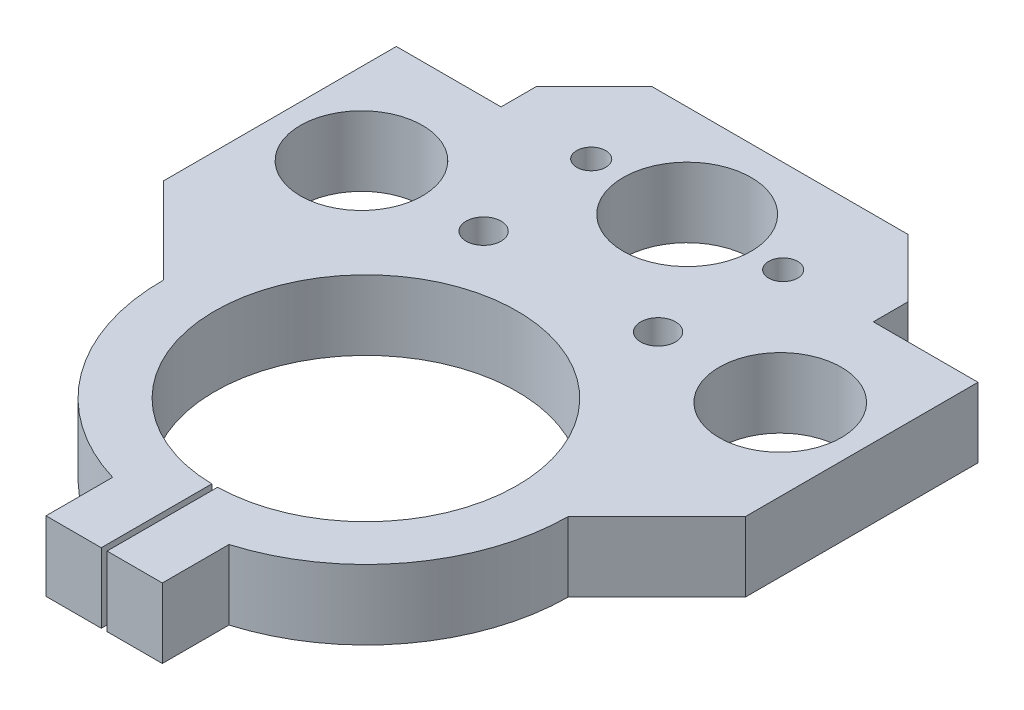
ISO-10303-21;
HEADER;
FILE_DESCRIPTION(('STEP AP214'),'2;1');
FILE_NAME('part.step','',(''),(''),'','','');
FILE_SCHEMA(('AUTOMOTIVE_DESIGN { 1 0 10303 214 1 1 1 1 }'));
ENDSEC;
DATA;
#1=APPLICATION_CONTEXT('core data for automotive mechanical design processes');
#2=APPLICATION_PROTOCOL_DEFINITION('international standard','automotive_design',2000,#1);
#3=PRODUCT_CONTEXT('',#1,'mechanical');
#4=PRODUCT('Part','Part','',(#3));
#5=PRODUCT_RELATED_PRODUCT_CATEGORY('part','',(#4));
#6=PRODUCT_DEFINITION_FORMATION('','',#4);
#7=PRODUCT_DEFINITION_CONTEXT('part definition',#1,'design');
#8=PRODUCT_DEFINITION('design','',#6,#7);
#9=PRODUCT_DEFINITION_SHAPE('','',#8);
#10=(LENGTH_UNIT() NAMED_UNIT(*) SI_UNIT(.MILLI.,.METRE.));
#11=(NAMED_UNIT(*) PLANE_ANGLE_UNIT() SI_UNIT($,.RADIAN.));
#12=(NAMED_UNIT(*) SI_UNIT($,.STERADIAN.) SOLID_ANGLE_UNIT());
#13=UNCERTAINTY_MEASURE_WITH_UNIT(LENGTH_MEASURE(1.E-05),#10,'distance_accuracy_value','');
#14=(GEOMETRIC_REPRESENTATION_CONTEXT(3) GLOBAL_UNCERTAINTY_ASSIGNED_CONTEXT((#13)) GLOBAL_UNIT_ASSIGNED_CONTEXT((#10,
#11,#12)) REPRESENTATION_CONTEXT('',''));
#15=CARTESIAN_POINT('',(0.,0.,0.));
#16=DIRECTION('',(0.,0.,1.));
#17=DIRECTION('',(1.,0.,0.));
#18=AXIS2_PLACEMENT_3D('',#15,#16,#17);
#19=CARTESIAN_POINT('',(50.,0.,100.));
#20=DIRECTION('',(0.,0.,1.));
#21=DIRECTION('',(1.,0.,0.));
#22=AXIS2_PLACEMENT_3D('',#19,#20,#21);
#23=PLANE('',#22);
#24=DIRECTION('',(0.,1.,0.));
#25=VECTOR('',#24,1.);
#26=CARTESIAN_POINT('',(0.265039177937347,-0.000999999999999265,100.));
#27=LINE('',#26,#25);
#28=CARTESIAN_POINT('',(0.265039177937347,0.,100.));
#29=VERTEX_POINT('',#28);
#30=CARTESIAN_POINT('',(0.265039177937347,12.,100.));
#31=VERTEX_POINT('',#30);
#32=EDGE_CURVE('E404',#29,#31,#27,.T.);
#33=ORIENTED_EDGE('',*,*,#32,.F.);
#34=DIRECTION('',(1.,0.,0.));
#35=VECTOR('',#34,1.);
#36=CARTESIAN_POINT('',(50.,0.,100.));
#37=LINE('',#36,#35);
#38=CARTESIAN_POINT('',(9.76503917793735,0.,100.));
#39=VERTEX_POINT('',#38);
#40=EDGE_CURVE('E264',#29,#39,#37,.T.);
#41=ORIENTED_EDGE('',*,*,#40,.T.);
#42=DIRECTION('',(0.,1.,0.));
#43=VECTOR('',#42,1.);
#44=CARTESIAN_POINT('',(9.76503917793735,-0.000999999999999265,100.));
#45=LINE('',#44,#43);
#46=CARTESIAN_POINT('',(9.76503917793735,12.,100.));
#47=VERTEX_POINT('',#46);
#48=EDGE_CURVE('E202',#39,#47,#45,.T.);
#49=ORIENTED_EDGE('',*,*,#48,.T.);
#50=DIRECTION('',(1.,0.,0.));
#51=VECTOR('',#50,1.);
#52=CARTESIAN_POINT('',(50.,12.,100.));
#53=LINE('',#52,#51);
#54=EDGE_CURVE('E259',#31,#47,#53,.T.);
#55=ORIENTED_EDGE('',*,*,#54,.F.);
#56=EDGE_LOOP('',(#33,#41,#49,#55));
#57=FACE_BOUND('',#56,.T.);
#58=ADVANCED_FACE('F32',(#57),#23,.T.);
#59=CARTESIAN_POINT('',(50.,12.,50.));
#60=DIRECTION('',(0.,1.,0.));
#61=DIRECTION('',(0.,0.,1.));
#62=AXIS2_PLACEMENT_3D('',#59,#60,#61);
#63=PLANE('',#62);
#64=CARTESIAN_POINT('',(-15.,12.,20.));
#65=DIRECTION('',(0.,1.,0.));
#66=DIRECTION('',(0.,0.,1.));
#67=AXIS2_PLACEMENT_3D('',#64,#65,#66);
#68=CIRCLE('',#67,3.);
#69=CARTESIAN_POINT('',(-15.,12.,23.));
#70=VERTEX_POINT('',#69);
#71=EDGE_CURVE('E685',#70,#70,#68,.T.);
#72=ORIENTED_EDGE('',*,*,#71,.F.);
#73=EDGE_LOOP('',(#72));
#74=FACE_BOUND('',#73,.T.);
#75=CARTESIAN_POINT('',(15.,12.,20.));
#76=DIRECTION('',(0.,1.,0.));
#77=DIRECTION('',(0.,0.,1.));
#78=AXIS2_PLACEMENT_3D('',#75,#76,#77);
#79=CIRCLE('',#78,3.);
#80=CARTESIAN_POINT('',(15.,12.,23.));
#81=VERTEX_POINT('',#80);
#82=EDGE_CURVE('E688',#81,#81,#79,.T.);
#83=ORIENTED_EDGE('',*,*,#82,.F.);
#84=EDGE_LOOP('',(#83));
#85=FACE_BOUND('',#84,.T.);
#86=CARTESIAN_POINT('',(16.5,12.,0.));
#87=DIRECTION('',(0.,1.,0.));
#88=DIRECTION('',(0.,0.,1.));
#89=AXIS2_PLACEMENT_3D('',#86,#87,#88);
#90=CIRCLE('',#89,2.5);
#91=CARTESIAN_POINT('',(16.5,12.,2.5));
#92=VERTEX_POINT('',#91);
#93=EDGE_CURVE('E697',#92,#92,#90,.T.);
#94=ORIENTED_EDGE('',*,*,#93,.F.);
#95=EDGE_LOOP('',(#94));
#96=FACE_BOUND('',#95,.T.);
#97=CARTESIAN_POINT('',(-16.5,12.,0.));
#98=DIRECTION('',(0.,1.,0.));
#99=DIRECTION('',(0.,0.,1.));
#100=AXIS2_PLACEMENT_3D('',#97,#98,#99);
#101=CIRCLE('',#100,2.5);
#102=CARTESIAN_POINT('',(-16.5,12.,2.5));
#103=VERTEX_POINT('',#102);
#104=EDGE_CURVE('E436',#103,#103,#101,.T.);
#105=ORIENTED_EDGE('',*,*,#104,.F.);
#106=EDGE_LOOP('',(#105));
#107=FACE_BOUND('',#106,.T.);
#108=DIRECTION('',(1.,0.,0.));
#109=VECTOR('',#108,1.);
#110=CARTESIAN_POINT('',(-32.,12.,-16.));
#111=LINE('',#110,#109);
#112=CARTESIAN_POINT('',(-22.,12.,-16.));
#113=VERTEX_POINT('',#112);
#114=CARTESIAN_POINT('',(22.,12.,-16.));
#115=VERTEX_POINT('',#114);
#116=EDGE_CURVE('E227',#113,#115,#111,.T.);
#117=ORIENTED_EDGE('',*,*,#116,.F.);
#118=DIRECTION('',(0.707106781186547,0.,-0.707106781186549));
#119=VECTOR('',#118,1.);
#120=CARTESIAN_POINT('',(-19.0000000000001,12.,-18.9999999999999));
#121=LINE('',#120,#119);
#122=CARTESIAN_POINT('',(-32.,12.,-6.));
#123=VERTEX_POINT('',#122);
#124=EDGE_CURVE('E288',#113,#123,#121,.F.);
#125=ORIENTED_EDGE('',*,*,#124,.T.);
#126=DIRECTION('',(0.,0.,-1.));
#127=VECTOR('',#126,1.);
#128=CARTESIAN_POINT('',(-32.,12.,0.));
#129=LINE('',#128,#127);
#130=CARTESIAN_POINT('',(-32.,12.,0.));
#131=VERTEX_POINT('',#130);
#132=EDGE_CURVE('E225',#131,#123,#129,.T.);
#133=ORIENTED_EDGE('',*,*,#132,.F.);
#134=DIRECTION('',(1.,0.,0.));
#135=VECTOR('',#134,1.);
#136=CARTESIAN_POINT('',(-50.,12.,0.));
#137=LINE('',#136,#135);
#138=CARTESIAN_POINT('',(-50.,12.,0.));
#139=VERTEX_POINT('',#138);
#140=EDGE_CURVE('E222',#139,#131,#137,.T.);
#141=ORIENTED_EDGE('',*,*,#140,.F.);
#142=DIRECTION('',(0.,0.,1.));
#143=VECTOR('',#142,1.);
#144=CARTESIAN_POINT('',(-50.,12.,-50.));
#145=LINE('',#144,#143);
#146=CARTESIAN_POINT('',(-50.,12.,40.));
#147=VERTEX_POINT('',#146);
#148=EDGE_CURVE('E274',#139,#147,#145,.T.);
#149=ORIENTED_EDGE('',*,*,#148,.T.);
#150=DIRECTION('',(-0.707106781186556,0.,-0.707106781186539));
#151=VECTOR('',#150,1.);
#152=CARTESIAN_POINT('',(-50.,12.,40.));
#153=LINE('',#152,#151);
#154=CARTESIAN_POINT('',(-35.2341773982398,12.,54.7658226017598));
#155=VERTEX_POINT('',#154);
#156=EDGE_CURVE('E418',#155,#147,#153,.T.);
#157=ORIENTED_EDGE('',*,*,#156,.F.);
#158=CARTESIAN_POINT('',(-0.234960822062653,12.,55.));
#159=DIRECTION('',(0.,-1.,0.));
#160=DIRECTION('',(0.,0.,1.));
#161=AXIS2_PLACEMENT_3D('',#158,#159,#160);
#162=CIRCLE('',#161,35.);
#163=CARTESIAN_POINT('',(-10.2349608220627,12.,88.5410196624969));
#164=VERTEX_POINT('',#163);
#165=EDGE_CURVE('E415',#164,#155,#162,.T.);
#166=ORIENTED_EDGE('',*,*,#165,.F.);
#167=DIRECTION('',(0.,0.,-1.));
#168=VECTOR('',#167,1.);
#169=CARTESIAN_POINT('',(-10.2349608220627,12.,88.5410196624969));
#170=LINE('',#169,#168);
#171=CARTESIAN_POINT('',(-10.2349608220627,12.,100.));
#172=VERTEX_POINT('',#171);
#173=EDGE_CURVE('E323',#172,#164,#170,.T.);
#174=ORIENTED_EDGE('',*,*,#173,.F.);
#175=CARTESIAN_POINT('',(-0.734960822062653,12.,100.));
#176=VERTEX_POINT('',#175);
#177=EDGE_CURVE('E195',#172,#176,#53,.T.);
#178=ORIENTED_EDGE('',*,*,#177,.T.);
#179=DIRECTION('',(0.,0.,1.));
#180=VECTOR('',#179,1.);
#181=CARTESIAN_POINT('',(-0.734960822062653,12.,80.9951918631119));
#182=LINE('',#181,#180);
#183=CARTESIAN_POINT('',(-0.734960822062653,12.,80.9951918631119));
#184=VERTEX_POINT('',#183);
#185=EDGE_CURVE('E174',#184,#176,#182,.T.);
#186=ORIENTED_EDGE('',*,*,#185,.F.);
#187=CARTESIAN_POINT('',(-0.234960822062653,12.,55.));
#188=DIRECTION('',(0.,1.,0.));
#189=DIRECTION('',(0.,0.,1.));
#190=AXIS2_PLACEMENT_3D('',#187,#188,#189);
#191=CIRCLE('',#190,26.);
#192=CARTESIAN_POINT('',(0.265039177937346,12.,80.9951918631119));
#193=VERTEX_POINT('',#192);
#194=EDGE_CURVE('E192',#193,#184,#191,.T.);
#195=ORIENTED_EDGE('',*,*,#194,.F.);
#196=DIRECTION('',(0.,0.,-1.));
#197=VECTOR('',#196,1.);
#198=CARTESIAN_POINT('',(0.265039177937347,12.,80.9951918631119));
#199=LINE('',#198,#197);
#200=EDGE_CURVE('E183',#31,#193,#199,.T.);
#201=ORIENTED_EDGE('',*,*,#200,.F.);
#202=ORIENTED_EDGE('',*,*,#54,.T.);
#203=DIRECTION('',(0.,0.,1.));
#204=VECTOR('',#203,1.);
#205=CARTESIAN_POINT('',(9.76503917793735,12.,88.5410196624969));
#206=LINE('',#205,#204);
#207=CARTESIAN_POINT('',(9.76503917793735,12.,88.5410196624969));
#208=VERTEX_POINT('',#207);
#209=EDGE_CURVE('E343',#208,#47,#206,.T.);
#210=ORIENTED_EDGE('',*,*,#209,.F.);
#211=CARTESIAN_POINT('',(-0.234960822062653,12.,55.));
#212=DIRECTION('',(0.,-1.,0.));
#213=DIRECTION('',(0.,0.,1.));
#214=AXIS2_PLACEMENT_3D('',#211,#212,#213);
#215=CIRCLE('',#214,35.);
#216=CARTESIAN_POINT('',(34.7642451640354,12.,55.2357548359648));
#217=VERTEX_POINT('',#216);
#218=EDGE_CURVE('E340',#217,#208,#215,.T.);
#219=ORIENTED_EDGE('',*,*,#218,.F.);
#220=DIRECTION('',(-0.707106781186544,0.,0.707106781186551));
#221=VECTOR('',#220,1.);
#222=CARTESIAN_POINT('',(50.,12.,40.));
#223=LINE('',#222,#221);
#224=CARTESIAN_POINT('',(50.,12.,40.));
#225=VERTEX_POINT('',#224);
#226=EDGE_CURVE('E337',#225,#217,#223,.T.);
#227=ORIENTED_EDGE('',*,*,#226,.F.);
#228=DIRECTION('',(0.,0.,-1.));
#229=VECTOR('',#228,1.);
#230=CARTESIAN_POINT('',(50.,12.,-50.));
#231=LINE('',#230,#229);
#232=CARTESIAN_POINT('',(50.,12.,0.));
#233=VERTEX_POINT('',#232);
#234=EDGE_CURVE('E272',#225,#233,#231,.T.);
#235=ORIENTED_EDGE('',*,*,#234,.T.);
#236=DIRECTION('',(1.,0.,0.));
#237=VECTOR('',#236,1.);
#238=CARTESIAN_POINT('',(32.,12.,0.));
#239=LINE('',#238,#237);
#240=CARTESIAN_POINT('',(32.,12.,0.));
#241=VERTEX_POINT('',#240);
#242=EDGE_CURVE('E232',#241,#233,#239,.T.);
#243=ORIENTED_EDGE('',*,*,#242,.F.);
#244=DIRECTION('',(0.,0.,1.));
#245=VECTOR('',#244,1.);
#246=CARTESIAN_POINT('',(32.,12.,-16.));
#247=LINE('',#246,#245);
#248=CARTESIAN_POINT('',(32.,12.,-6.00000000000006));
#249=VERTEX_POINT('',#248);
#250=EDGE_CURVE('E230',#249,#241,#247,.T.);
#251=ORIENTED_EDGE('',*,*,#250,.F.);
#252=DIRECTION('',(0.707106781186549,0.,0.707106781186547));
#253=VECTOR('',#252,1.);
#254=CARTESIAN_POINT('',(69.0000000000001,12.,30.9999999999999));
#255=LINE('',#254,#253);
#256=EDGE_CURVE('E286',#249,#115,#255,.F.);
#257=ORIENTED_EDGE('',*,*,#256,.T.);
#258=EDGE_LOOP('',(#117,#125,#133,#141,#149,#157,#166,#174,#178,#186,#195,#201,#202,#210,#219,
#227,#235,#243,#251,#257));
#259=FACE_BOUND('',#258,.T.);
#260=CARTESIAN_POINT('',(36.,12.,20.));
#261=DIRECTION('',(0.,1.,0.));
#262=DIRECTION('',(0.,0.,1.));
#263=AXIS2_PLACEMENT_3D('',#260,#261,#262);
#264=CIRCLE('',#263,10.5);
#265=CARTESIAN_POINT('',(36.,12.,30.5));
#266=VERTEX_POINT('',#265);
#267=EDGE_CURVE('E247',#266,#266,#264,.T.);
#268=ORIENTED_EDGE('',*,*,#267,.F.);
#269=EDGE_LOOP('',(#268));
#270=FACE_BOUND('',#269,.T.);
#271=CARTESIAN_POINT('',(-36.,12.,20.));
#272=DIRECTION('',(0.,1.,0.));
#273=DIRECTION('',(0.,0.,1.));
#274=AXIS2_PLACEMENT_3D('',#271,#272,#273);
#275=CIRCLE('',#274,10.5);
#276=CARTESIAN_POINT('',(-36.,12.,30.5));
#277=VERTEX_POINT('',#276);
#278=EDGE_CURVE('E253',#277,#277,#275,.T.);
#279=ORIENTED_EDGE('',*,*,#278,.F.);
#280=EDGE_LOOP('',(#279));
#281=FACE_BOUND('',#280,.T.);
#282=CARTESIAN_POINT('',(0.,12.,0.));
#283=DIRECTION('',(0.,1.,0.));
#284=DIRECTION('',(0.,0.,1.));
#285=AXIS2_PLACEMENT_3D('',#282,#283,#284);
#286=CIRCLE('',#285,11.);
#287=CARTESIAN_POINT('',(0.,12.,11.));
#288=VERTEX_POINT('',#287);
#289=EDGE_CURVE('E266',#288,#288,#286,.T.);
#290=ORIENTED_EDGE('',*,*,#289,.F.);
#291=EDGE_LOOP('',(#290));
#292=FACE_BOUND('',#291,.T.);
#293=ADVANCED_FACE('F189',(#74,#85,#96,#107,#259,#270,#281,#292),#63,.T.);
#294=CARTESIAN_POINT('',(50.,0.,50.));
#295=DIRECTION('',(0.,1.,0.));
#296=DIRECTION('',(0.,0.,1.));
#297=AXIS2_PLACEMENT_3D('',#294,#295,#296);
#298=PLANE('',#297);
#299=CARTESIAN_POINT('',(-15.,0.,20.));
#300=DIRECTION('',(0.,1.,0.));
#301=DIRECTION('',(0.,0.,1.));
#302=AXIS2_PLACEMENT_3D('',#299,#300,#301);
#303=CIRCLE('',#302,3.);
#304=CARTESIAN_POINT('',(-15.,0.,23.));
#305=VERTEX_POINT('',#304);
#306=EDGE_CURVE('E687',#305,#305,#303,.F.);
#307=ORIENTED_EDGE('',*,*,#306,.F.);
#308=EDGE_LOOP('',(#307));
#309=FACE_BOUND('',#308,.T.);
#310=CARTESIAN_POINT('',(15.,0.,20.));
#311=DIRECTION('',(0.,1.,0.));
#312=DIRECTION('',(0.,0.,1.));
#313=AXIS2_PLACEMENT_3D('',#310,#311,#312);
#314=CIRCLE('',#313,3.);
#315=CARTESIAN_POINT('',(15.,0.,23.));
#316=VERTEX_POINT('',#315);
#317=EDGE_CURVE('E691',#316,#316,#314,.F.);
#318=ORIENTED_EDGE('',*,*,#317,.F.);
#319=EDGE_LOOP('',(#318));
#320=FACE_BOUND('',#319,.T.);
#321=CARTESIAN_POINT('',(16.5,0.,0.));
#322=DIRECTION('',(0.,1.,0.));
#323=DIRECTION('',(0.,0.,1.));
#324=AXIS2_PLACEMENT_3D('',#321,#322,#323);
#325=CIRCLE('',#324,2.5);
#326=CARTESIAN_POINT('',(16.5,0.,2.5));
#327=VERTEX_POINT('',#326);
#328=EDGE_CURVE('E700',#327,#327,#325,.F.);
#329=ORIENTED_EDGE('',*,*,#328,.F.);
#330=EDGE_LOOP('',(#329));
#331=FACE_BOUND('',#330,.T.);
#332=CARTESIAN_POINT('',(-16.5,0.,0.));
#333=DIRECTION('',(0.,1.,0.));
#334=DIRECTION('',(0.,0.,1.));
#335=AXIS2_PLACEMENT_3D('',#332,#333,#334);
#336=CIRCLE('',#335,2.5);
#337=CARTESIAN_POINT('',(-16.5,0.,2.5));
#338=VERTEX_POINT('',#337);
#339=EDGE_CURVE('E433',#338,#338,#336,.F.);
#340=ORIENTED_EDGE('',*,*,#339,.F.);
#341=EDGE_LOOP('',(#340));
#342=FACE_BOUND('',#341,.T.);
#343=DIRECTION('',(0.,0.,1.));
#344=VECTOR('',#343,1.);
#345=CARTESIAN_POINT('',(-32.,0.,0.));
#346=LINE('',#345,#344);
#347=CARTESIAN_POINT('',(-32.,0.,-5.99999999999999));
#348=VERTEX_POINT('',#347);
#349=CARTESIAN_POINT('',(-32.,0.,0.));
#350=VERTEX_POINT('',#349);
#351=EDGE_CURVE('E204',#348,#350,#346,.T.);
#352=ORIENTED_EDGE('',*,*,#351,.F.);
#353=DIRECTION('',(-0.707106781186547,0.,0.707106781186549));
#354=VECTOR('',#353,1.);
#355=CARTESIAN_POINT('',(-22.,0.,-16.));
#356=LINE('',#355,#354);
#357=CARTESIAN_POINT('',(-22.,0.,-16.));
#358=VERTEX_POINT('',#357);
#359=EDGE_CURVE('E40',#348,#358,#356,.F.);
#360=ORIENTED_EDGE('',*,*,#359,.T.);
#361=DIRECTION('',(-1.,0.,0.));
#362=VECTOR('',#361,1.);
#363=CARTESIAN_POINT('',(-32.,0.,-16.));
#364=LINE('',#363,#362);
#365=CARTESIAN_POINT('',(22.,0.,-16.));
#366=VERTEX_POINT('',#365);
#367=EDGE_CURVE('E214',#366,#358,#364,.T.);
#368=ORIENTED_EDGE('',*,*,#367,.F.);
#369=DIRECTION('',(-0.707106781186549,0.,-0.707106781186547));
#370=VECTOR('',#369,1.);
#371=CARTESIAN_POINT('',(32.,0.,-6.00000000000002));
#372=LINE('',#371,#370);
#373=CARTESIAN_POINT('',(32.,0.,-6.00000000000003));
#374=VERTEX_POINT('',#373);
#375=EDGE_CURVE('E47',#366,#374,#372,.F.);
#376=ORIENTED_EDGE('',*,*,#375,.T.);
#377=DIRECTION('',(0.,0.,-1.));
#378=VECTOR('',#377,1.);
#379=CARTESIAN_POINT('',(32.,0.,-16.));
#380=LINE('',#379,#378);
#381=CARTESIAN_POINT('',(32.,0.,0.));
#382=VERTEX_POINT('',#381);
#383=EDGE_CURVE('E217',#382,#374,#380,.T.);
#384=ORIENTED_EDGE('',*,*,#383,.F.);
#385=DIRECTION('',(-1.,0.,0.));
#386=VECTOR('',#385,1.);
#387=CARTESIAN_POINT('',(32.,0.,0.));
#388=LINE('',#387,#386);
#389=CARTESIAN_POINT('',(50.,0.,0.));
#390=VERTEX_POINT('',#389);
#391=EDGE_CURVE('E219',#390,#382,#388,.T.);
#392=ORIENTED_EDGE('',*,*,#391,.F.);
#393=DIRECTION('',(0.,0.,-1.));
#394=VECTOR('',#393,1.);
#395=CARTESIAN_POINT('',(50.,0.,-50.));
#396=LINE('',#395,#394);
#397=CARTESIAN_POINT('',(50.,0.,40.));
#398=VERTEX_POINT('',#397);
#399=EDGE_CURVE('E269',#398,#390,#396,.T.);
#400=ORIENTED_EDGE('',*,*,#399,.F.);
#401=DIRECTION('',(0.707106781186544,0.,-0.707106781186551));
#402=VECTOR('',#401,1.);
#403=CARTESIAN_POINT('',(50.,0.,40.));
#404=LINE('',#403,#402);
#405=CARTESIAN_POINT('',(34.7642451640354,0.,55.2357548359648));
#406=VERTEX_POINT('',#405);
#407=EDGE_CURVE('E329',#406,#398,#404,.T.);
#408=ORIENTED_EDGE('',*,*,#407,.F.);
#409=CARTESIAN_POINT('',(-0.234960822062653,0.,55.));
#410=DIRECTION('',(0.,1.,0.));
#411=DIRECTION('',(0.,0.,1.));
#412=AXIS2_PLACEMENT_3D('',#409,#410,#411);
#413=CIRCLE('',#412,35.);
#414=CARTESIAN_POINT('',(9.76503917793735,0.,88.5410196624969));
#415=VERTEX_POINT('',#414);
#416=EDGE_CURVE('E331',#415,#406,#413,.T.);
#417=ORIENTED_EDGE('',*,*,#416,.F.);
#418=DIRECTION('',(0.,0.,-1.));
#419=VECTOR('',#418,1.);
#420=CARTESIAN_POINT('',(9.76503917793735,0.,88.5410196624969));
#421=LINE('',#420,#419);
#422=EDGE_CURVE('E334',#39,#415,#421,.T.);
#423=ORIENTED_EDGE('',*,*,#422,.F.);
#424=ORIENTED_EDGE('',*,*,#40,.F.);
#425=DIRECTION('',(0.,0.,1.));
#426=VECTOR('',#425,1.);
#427=CARTESIAN_POINT('',(0.265039177937347,0.,80.9951918631119));
#428=LINE('',#427,#426);
#429=CARTESIAN_POINT('',(0.265039177937347,0.,80.9951918631119));
#430=VERTEX_POINT('',#429);
#431=EDGE_CURVE('E196',#430,#29,#428,.T.);
#432=ORIENTED_EDGE('',*,*,#431,.F.);
#433=CARTESIAN_POINT('',(-0.234960822062653,0.,55.));
#434=DIRECTION('',(0.,1.,0.));
#435=DIRECTION('',(0.,0.,1.));
#436=AXIS2_PLACEMENT_3D('',#433,#434,#435);
#437=CIRCLE('',#436,26.);
#438=CARTESIAN_POINT('',(-0.734960822062653,0.,80.9951918631119));
#439=VERTEX_POINT('',#438);
#440=EDGE_CURVE('E201',#439,#430,#437,.F.);
#441=ORIENTED_EDGE('',*,*,#440,.F.);
#442=DIRECTION('',(0.,0.,-1.));
#443=VECTOR('',#442,1.);
#444=CARTESIAN_POINT('',(-0.734960822062653,0.,80.9951918631119));
#445=LINE('',#444,#443);
#446=CARTESIAN_POINT('',(-0.734960822062653,0.,100.));
#447=VERTEX_POINT('',#446);
#448=EDGE_CURVE('E177',#447,#439,#445,.T.);
#449=ORIENTED_EDGE('',*,*,#448,.F.);
#450=CARTESIAN_POINT('',(-10.2349608220627,0.,100.));
#451=VERTEX_POINT('',#450);
#452=EDGE_CURVE('E260',#451,#447,#37,.T.);
#453=ORIENTED_EDGE('',*,*,#452,.F.);
#454=DIRECTION('',(0.,0.,1.));
#455=VECTOR('',#454,1.);
#456=CARTESIAN_POINT('',(-10.2349608220627,0.,88.5410196624969));
#457=LINE('',#456,#455);
#458=CARTESIAN_POINT('',(-10.2349608220627,0.,88.5410196624969));
#459=VERTEX_POINT('',#458);
#460=EDGE_CURVE('E413',#459,#451,#457,.T.);
#461=ORIENTED_EDGE('',*,*,#460,.F.);
#462=CARTESIAN_POINT('',(-0.234960822062653,0.,55.));
#463=DIRECTION('',(0.,1.,0.));
#464=DIRECTION('',(0.,0.,1.));
#465=AXIS2_PLACEMENT_3D('',#462,#463,#464);
#466=CIRCLE('',#465,35.);
#467=CARTESIAN_POINT('',(-35.2341773982398,0.,54.7658226017598));
#468=VERTEX_POINT('',#467);
#469=EDGE_CURVE('E410',#468,#459,#466,.T.);
#470=ORIENTED_EDGE('',*,*,#469,.F.);
#471=DIRECTION('',(0.707106781186556,0.,0.707106781186539));
#472=VECTOR('',#471,1.);
#473=CARTESIAN_POINT('',(-50.,0.,40.));
#474=LINE('',#473,#472);
#475=CARTESIAN_POINT('',(-50.,0.,40.));
#476=VERTEX_POINT('',#475);
#477=EDGE_CURVE('E327',#476,#468,#474,.T.);
#478=ORIENTED_EDGE('',*,*,#477,.F.);
#479=DIRECTION('',(0.,0.,1.));
#480=VECTOR('',#479,1.);
#481=CARTESIAN_POINT('',(-50.,0.,-50.));
#482=LINE('',#481,#480);
#483=CARTESIAN_POINT('',(-50.,0.,0.));
#484=VERTEX_POINT('',#483);
#485=EDGE_CURVE('E275',#484,#476,#482,.T.);
#486=ORIENTED_EDGE('',*,*,#485,.F.);
#487=DIRECTION('',(-1.,0.,0.));
#488=VECTOR('',#487,1.);
#489=CARTESIAN_POINT('',(-50.,0.,0.));
#490=LINE('',#489,#488);
#491=EDGE_CURVE('E239',#350,#484,#490,.T.);
#492=ORIENTED_EDGE('',*,*,#491,.F.);
#493=EDGE_LOOP('',(#352,#360,#368,#376,#384,#392,#400,#408,#417,#423,#424,#432,#441,#449,#453,
#461,#470,#478,#486,#492));
#494=FACE_BOUND('',#493,.T.);
#495=CARTESIAN_POINT('',(36.,0.,20.));
#496=DIRECTION('',(0.,1.,0.));
#497=DIRECTION('',(0.,0.,1.));
#498=AXIS2_PLACEMENT_3D('',#495,#496,#497);
#499=CIRCLE('',#498,10.5);
#500=CARTESIAN_POINT('',(36.,0.,30.5));
#501=VERTEX_POINT('',#500);
#502=EDGE_CURVE('E250',#501,#501,#499,.F.);
#503=ORIENTED_EDGE('',*,*,#502,.F.);
#504=EDGE_LOOP('',(#503));
#505=FACE_BOUND('',#504,.T.);
#506=CARTESIAN_POINT('',(-36.,0.,20.));
#507=DIRECTION('',(0.,1.,0.));
#508=DIRECTION('',(0.,0.,1.));
#509=AXIS2_PLACEMENT_3D('',#506,#507,#508);
#510=CIRCLE('',#509,10.5);
#511=CARTESIAN_POINT('',(-36.,0.,30.5));
#512=VERTEX_POINT('',#511);
#513=EDGE_CURVE('E256',#512,#512,#510,.F.);
#514=ORIENTED_EDGE('',*,*,#513,.F.);
#515=EDGE_LOOP('',(#514));
#516=FACE_BOUND('',#515,.T.);
#517=CARTESIAN_POINT('',(0.,0.,0.));
#518=DIRECTION('',(0.,1.,0.));
#519=DIRECTION('',(0.,0.,1.));
#520=AXIS2_PLACEMENT_3D('',#517,#518,#519);
#521=CIRCLE('',#520,11.);
#522=CARTESIAN_POINT('',(0.,0.,11.));
#523=VERTEX_POINT('',#522);
#524=EDGE_CURVE('E263',#523,#523,#521,.T.);
#525=ORIENTED_EDGE('',*,*,#524,.T.);
#526=EDGE_LOOP('',(#525));
#527=FACE_BOUND('',#526,.T.);
#528=ADVANCED_FACE('F292',(#309,#320,#331,#342,#494,#505,#516,#527),#298,.F.);
#529=CARTESIAN_POINT('',(50.,12.,-50.));
#530=DIRECTION('',(-1.,0.,0.));
#531=DIRECTION('',(0.,0.,1.));
#532=AXIS2_PLACEMENT_3D('',#529,#530,#531);
#533=PLANE('',#532);
#534=ORIENTED_EDGE('',*,*,#234,.F.);
#535=DIRECTION('',(0.,1.,0.));
#536=VECTOR('',#535,1.);
#537=CARTESIAN_POINT('',(50.,-0.000999999999999265,40.));
#538=LINE('',#537,#536);
#539=EDGE_CURVE('E210',#398,#225,#538,.T.);
#540=ORIENTED_EDGE('',*,*,#539,.F.);
#541=ORIENTED_EDGE('',*,*,#399,.T.);
#542=DIRECTION('',(0.,1.,0.));
#543=VECTOR('',#542,1.);
#544=CARTESIAN_POINT('',(50.,-0.000999999999999265,0.));
#545=LINE('',#544,#543);
#546=EDGE_CURVE('E236',#390,#233,#545,.T.);
#547=ORIENTED_EDGE('',*,*,#546,.T.);
#548=EDGE_LOOP('',(#534,#540,#541,#547));
#549=FACE_BOUND('',#548,.T.);
#550=ADVANCED_FACE('F359',(#549),#533,.F.);
#551=CARTESIAN_POINT('',(-50.,12.,-50.));
#552=DIRECTION('',(1.,0.,0.));
#553=DIRECTION('',(0.,0.,-1.));
#554=AXIS2_PLACEMENT_3D('',#551,#552,#553);
#555=PLANE('',#554);
#556=ORIENTED_EDGE('',*,*,#485,.T.);
#557=DIRECTION('',(0.,1.,0.));
#558=VECTOR('',#557,1.);
#559=CARTESIAN_POINT('',(-50.,-0.000999999999999265,40.));
#560=LINE('',#559,#558);
#561=EDGE_CURVE('E314',#476,#147,#560,.T.);
#562=ORIENTED_EDGE('',*,*,#561,.T.);
#563=ORIENTED_EDGE('',*,*,#148,.F.);
#564=DIRECTION('',(0.,1.,0.));
#565=VECTOR('',#564,1.);
#566=CARTESIAN_POINT('',(-50.,-0.000999999999999265,0.));
#567=LINE('',#566,#565);
#568=EDGE_CURVE('E235',#484,#139,#567,.T.);
#569=ORIENTED_EDGE('',*,*,#568,.F.);
#570=EDGE_LOOP('',(#556,#562,#563,#569));
#571=FACE_BOUND('',#570,.T.);
#572=ADVANCED_FACE('F312',(#571),#555,.F.);
#573=CARTESIAN_POINT('',(0.,12.,0.));
#574=DIRECTION('',(0.,-1.,0.));
#575=DIRECTION('',(0.,0.,-1.));
#576=AXIS2_PLACEMENT_3D('',#573,#574,#575);
#577=CYLINDRICAL_SURFACE('',#576,11.);
#578=ORIENTED_EDGE('',*,*,#289,.T.);
#579=EDGE_LOOP('',(#578));
#580=FACE_BOUND('',#579,.T.);
#581=ORIENTED_EDGE('',*,*,#524,.F.);
#582=EDGE_LOOP('',(#581));
#583=FACE_BOUND('',#582,.T.);
#584=ADVANCED_FACE('F393',(#580,#583),#577,.F.);
#585=DIRECTION('',(0.,1.,0.));
#586=VECTOR('',#585,1.);
#587=CARTESIAN_POINT('',(-0.734960822062653,-0.000999999999999265,100.));
#588=LINE('',#587,#586);
#589=EDGE_CURVE('E182',#447,#176,#588,.T.);
#590=ORIENTED_EDGE('',*,*,#589,.T.);
#591=ORIENTED_EDGE('',*,*,#177,.F.);
#592=DIRECTION('',(0.,1.,0.));
#593=VECTOR('',#592,1.);
#594=CARTESIAN_POINT('',(-10.2349608220627,-0.000999999999999265,100.));
#595=LINE('',#594,#593);
#596=EDGE_CURVE('E318',#451,#172,#595,.T.);
#597=ORIENTED_EDGE('',*,*,#596,.F.);
#598=ORIENTED_EDGE('',*,*,#452,.T.);
#599=EDGE_LOOP('',(#590,#591,#597,#598));
#600=FACE_BOUND('',#599,.T.);
#601=ADVANCED_FACE('F382',(#600),#23,.T.);
#602=CARTESIAN_POINT('',(-36.,-0.000999999999999265,20.));
#603=DIRECTION('',(0.,1.,0.));
#604=DIRECTION('',(0.,0.,1.));
#605=AXIS2_PLACEMENT_3D('',#602,#603,#604);
#606=CYLINDRICAL_SURFACE('',#605,10.5);
#607=ORIENTED_EDGE('',*,*,#278,.T.);
#608=EDGE_LOOP('',(#607));
#609=FACE_BOUND('',#608,.T.);
#610=ORIENTED_EDGE('',*,*,#513,.T.);
#611=EDGE_LOOP('',(#610));
#612=FACE_BOUND('',#611,.T.);
#613=ADVANCED_FACE('F392',(#609,#612),#606,.F.);
#614=CARTESIAN_POINT('',(36.,-0.000999999999999265,20.));
#615=DIRECTION('',(0.,1.,0.));
#616=DIRECTION('',(0.,0.,1.));
#617=AXIS2_PLACEMENT_3D('',#614,#615,#616);
#618=CYLINDRICAL_SURFACE('',#617,10.5);
#619=ORIENTED_EDGE('',*,*,#267,.T.);
#620=EDGE_LOOP('',(#619));
#621=FACE_BOUND('',#620,.T.);
#622=ORIENTED_EDGE('',*,*,#502,.T.);
#623=EDGE_LOOP('',(#622));
#624=FACE_BOUND('',#623,.T.);
#625=ADVANCED_FACE('F399',(#621,#624),#618,.F.);
#626=CARTESIAN_POINT('',(32.,-0.000999999999999265,0.));
#627=DIRECTION('',(0.,0.,1.));
#628=DIRECTION('',(1.,0.,0.));
#629=AXIS2_PLACEMENT_3D('',#626,#627,#628);
#630=PLANE('',#629);
#631=ORIENTED_EDGE('',*,*,#391,.T.);
#632=DIRECTION('',(0.,1.,0.));
#633=VECTOR('',#632,1.);
#634=CARTESIAN_POINT('',(32.,-0.000999999999999265,0.));
#635=LINE('',#634,#633);
#636=EDGE_CURVE('E240',#382,#241,#635,.T.);
#637=ORIENTED_EDGE('',*,*,#636,.T.);
#638=ORIENTED_EDGE('',*,*,#242,.T.);
#639=ORIENTED_EDGE('',*,*,#546,.F.);
#640=EDGE_LOOP('',(#631,#637,#638,#639));
#641=FACE_BOUND('',#640,.T.);
#642=ADVANCED_FACE('F363',(#641),#630,.F.);
#643=CARTESIAN_POINT('',(32.,-0.000999999999999265,-16.));
#644=DIRECTION('',(-1.,0.,0.));
#645=DIRECTION('',(0.,0.,1.));
#646=AXIS2_PLACEMENT_3D('',#643,#644,#645);
#647=PLANE('',#646);
#648=ORIENTED_EDGE('',*,*,#383,.T.);
#649=DIRECTION('',(0.,1.,0.));
#650=VECTOR('',#649,1.);
#651=CARTESIAN_POINT('',(32.,-0.000999999999999265,-6.00000000000002));
#652=LINE('',#651,#650);
#653=EDGE_CURVE('E11',#374,#249,#652,.T.);
#654=ORIENTED_EDGE('',*,*,#653,.T.);
#655=ORIENTED_EDGE('',*,*,#250,.T.);
#656=ORIENTED_EDGE('',*,*,#636,.F.);
#657=EDGE_LOOP('',(#648,#654,#655,#656));
#658=FACE_BOUND('',#657,.T.);
#659=ADVANCED_FACE('F366',(#658),#647,.F.);
#660=CARTESIAN_POINT('',(-32.,-0.000999999999999265,-16.));
#661=DIRECTION('',(0.,0.,1.));
#662=DIRECTION('',(1.,0.,0.));
#663=AXIS2_PLACEMENT_3D('',#660,#661,#662);
#664=PLANE('',#663);
#665=ORIENTED_EDGE('',*,*,#367,.T.);
#666=DIRECTION('',(0.,1.,0.));
#667=VECTOR('',#666,1.);
#668=CARTESIAN_POINT('',(-22.,-0.000999999999999265,-16.));
#669=LINE('',#668,#667);
#670=EDGE_CURVE('E283',#358,#113,#669,.T.);
#671=ORIENTED_EDGE('',*,*,#670,.T.);
#672=ORIENTED_EDGE('',*,*,#116,.T.);
#673=DIRECTION('',(0.,-1.,0.));
#674=VECTOR('',#673,1.);
#675=CARTESIAN_POINT('',(22.,-0.000999999999999265,-16.));
#676=LINE('',#675,#674);
#677=EDGE_CURVE('E278',#115,#366,#676,.T.);
#678=ORIENTED_EDGE('',*,*,#677,.T.);
#679=EDGE_LOOP('',(#665,#671,#672,#678));
#680=FACE_BOUND('',#679,.T.);
#681=ADVANCED_FACE('F298',(#680),#664,.F.);
#682=CARTESIAN_POINT('',(-32.,-0.000999999999999265,0.));
#683=DIRECTION('',(1.,0.,0.));
#684=DIRECTION('',(0.,0.,-1.));
#685=AXIS2_PLACEMENT_3D('',#682,#683,#684);
#686=PLANE('',#685);
#687=ORIENTED_EDGE('',*,*,#132,.T.);
#688=DIRECTION('',(0.,-1.,0.));
#689=VECTOR('',#688,1.);
#690=CARTESIAN_POINT('',(-32.,-0.000999999999999265,-6.));
#691=LINE('',#690,#689);
#692=EDGE_CURVE('E55',#123,#348,#691,.T.);
#693=ORIENTED_EDGE('',*,*,#692,.T.);
#694=ORIENTED_EDGE('',*,*,#351,.T.);
#695=DIRECTION('',(0.,1.,0.));
#696=VECTOR('',#695,1.);
#697=CARTESIAN_POINT('',(-32.,-0.000999999999999265,0.));
#698=LINE('',#697,#696);
#699=EDGE_CURVE('E243',#350,#131,#698,.T.);
#700=ORIENTED_EDGE('',*,*,#699,.T.);
#701=EDGE_LOOP('',(#687,#693,#694,#700));
#702=FACE_BOUND('',#701,.T.);
#703=ADVANCED_FACE('F303',(#702),#686,.F.);
#704=CARTESIAN_POINT('',(-50.,-0.000999999999999265,0.));
#705=DIRECTION('',(0.,0.,1.));
#706=DIRECTION('',(1.,0.,0.));
#707=AXIS2_PLACEMENT_3D('',#704,#705,#706);
#708=PLANE('',#707);
#709=ORIENTED_EDGE('',*,*,#491,.T.);
#710=ORIENTED_EDGE('',*,*,#568,.T.);
#711=ORIENTED_EDGE('',*,*,#140,.T.);
#712=ORIENTED_EDGE('',*,*,#699,.F.);
#713=EDGE_LOOP('',(#709,#710,#711,#712));
#714=FACE_BOUND('',#713,.T.);
#715=ADVANCED_FACE('F306',(#714),#708,.F.);
#716=CARTESIAN_POINT('',(-0.234960822062653,-0.000999999999999265,55.));
#717=DIRECTION('',(0.,1.,0.));
#718=DIRECTION('',(0.,0.,1.));
#719=AXIS2_PLACEMENT_3D('',#716,#717,#718);
#720=CYLINDRICAL_SURFACE('',#719,26.);
#721=ORIENTED_EDGE('',*,*,#440,.T.);
#722=DIRECTION('',(0.,1.,0.));
#723=VECTOR('',#722,1.);
#724=CARTESIAN_POINT('',(0.265039177937347,-0.000999999999999265,80.9951918631119));
#725=LINE('',#724,#723);
#726=EDGE_CURVE('E200',#430,#193,#725,.T.);
#727=ORIENTED_EDGE('',*,*,#726,.T.);
#728=ORIENTED_EDGE('',*,*,#194,.T.);
#729=DIRECTION('',(0.,1.,0.));
#730=VECTOR('',#729,1.);
#731=CARTESIAN_POINT('',(-0.734960822062653,-0.000999999999999265,80.9951918631119));
#732=LINE('',#731,#730);
#733=EDGE_CURVE('E171',#439,#184,#732,.T.);
#734=ORIENTED_EDGE('',*,*,#733,.F.);
#735=EDGE_LOOP('',(#721,#727,#728,#734));
#736=FACE_BOUND('',#735,.T.);
#737=ADVANCED_FACE('F199',(#736),#720,.F.);
#738=CARTESIAN_POINT('',(9.76503917793735,-0.000999999999999265,88.5410196624969));
#739=DIRECTION('',(-1.,0.,0.));
#740=DIRECTION('',(0.,0.,1.));
#741=AXIS2_PLACEMENT_3D('',#738,#739,#740);
#742=PLANE('',#741);
#743=ORIENTED_EDGE('',*,*,#422,.T.);
#744=DIRECTION('',(0.,1.,0.));
#745=VECTOR('',#744,1.);
#746=CARTESIAN_POINT('',(9.76503917793735,-0.000999999999999265,88.5410196624969));
#747=LINE('',#746,#745);
#748=EDGE_CURVE('E207',#415,#208,#747,.T.);
#749=ORIENTED_EDGE('',*,*,#748,.T.);
#750=ORIENTED_EDGE('',*,*,#209,.T.);
#751=ORIENTED_EDGE('',*,*,#48,.F.);
#752=EDGE_LOOP('',(#743,#749,#750,#751));
#753=FACE_BOUND('',#752,.T.);
#754=ADVANCED_FACE('F444',(#753),#742,.F.);
#755=CARTESIAN_POINT('',(-0.234960822062653,-0.000999999999999265,55.));
#756=DIRECTION('',(0.,1.,0.));
#757=DIRECTION('',(0.,0.,1.));
#758=AXIS2_PLACEMENT_3D('',#755,#756,#757);
#759=CYLINDRICAL_SURFACE('',#758,35.);
#760=ORIENTED_EDGE('',*,*,#416,.T.);
#761=DIRECTION('',(0.,1.,0.));
#762=VECTOR('',#761,1.);
#763=CARTESIAN_POINT('',(34.7642451640354,-0.000999999999999265,55.2357548359648));
#764=LINE('',#763,#762);
#765=EDGE_CURVE('E346',#406,#217,#764,.T.);
#766=ORIENTED_EDGE('',*,*,#765,.T.);
#767=ORIENTED_EDGE('',*,*,#218,.T.);
#768=ORIENTED_EDGE('',*,*,#748,.F.);
#769=EDGE_LOOP('',(#760,#766,#767,#768));
#770=FACE_BOUND('',#769,.T.);
#771=ADVANCED_FACE('F446',(#770),#759,.T.);
#772=CARTESIAN_POINT('',(50.,-0.000999999999999265,40.));
#773=DIRECTION('',(-0.707106781186551,0.,-0.707106781186544));
#774=DIRECTION('',(-0.707106781186544,0.,0.707106781186551));
#775=AXIS2_PLACEMENT_3D('',#772,#773,#774);
#776=PLANE('',#775);
#777=ORIENTED_EDGE('',*,*,#407,.T.);
#778=ORIENTED_EDGE('',*,*,#539,.T.);
#779=ORIENTED_EDGE('',*,*,#226,.T.);
#780=ORIENTED_EDGE('',*,*,#765,.F.);
#781=EDGE_LOOP('',(#777,#778,#779,#780));
#782=FACE_BOUND('',#781,.T.);
#783=ADVANCED_FACE('F351',(#782),#776,.F.);
#784=CARTESIAN_POINT('',(-0.234960822062653,-0.000999999999999265,55.));
#785=DIRECTION('',(0.,1.,0.));
#786=DIRECTION('',(0.,0.,1.));
#787=AXIS2_PLACEMENT_3D('',#784,#785,#786);
#788=CYLINDRICAL_SURFACE('',#787,35.);
#789=ORIENTED_EDGE('',*,*,#469,.T.);
#790=DIRECTION('',(0.,1.,0.));
#791=VECTOR('',#790,1.);
#792=CARTESIAN_POINT('',(-10.2349608220627,-0.000999999999999265,88.5410196624969));
#793=LINE('',#792,#791);
#794=EDGE_CURVE('E321',#459,#164,#793,.T.);
#795=ORIENTED_EDGE('',*,*,#794,.T.);
#796=ORIENTED_EDGE('',*,*,#165,.T.);
#797=DIRECTION('',(0.,1.,0.));
#798=VECTOR('',#797,1.);
#799=CARTESIAN_POINT('',(-35.2341773982398,-0.000999999999999265,54.7658226017598));
#800=LINE('',#799,#798);
#801=EDGE_CURVE('E319',#468,#155,#800,.T.);
#802=ORIENTED_EDGE('',*,*,#801,.F.);
#803=EDGE_LOOP('',(#789,#795,#796,#802));
#804=FACE_BOUND('',#803,.T.);
#805=ADVANCED_FACE('F422',(#804),#788,.T.);
#806=CARTESIAN_POINT('',(-10.2349608220627,-0.000999999999999265,88.5410196624969));
#807=DIRECTION('',(1.,0.,0.));
#808=DIRECTION('',(0.,0.,-1.));
#809=AXIS2_PLACEMENT_3D('',#806,#807,#808);
#810=PLANE('',#809);
#811=ORIENTED_EDGE('',*,*,#460,.T.);
#812=ORIENTED_EDGE('',*,*,#596,.T.);
#813=ORIENTED_EDGE('',*,*,#173,.T.);
#814=ORIENTED_EDGE('',*,*,#794,.F.);
#815=EDGE_LOOP('',(#811,#812,#813,#814));
#816=FACE_BOUND('',#815,.T.);
#817=ADVANCED_FACE('F427',(#816),#810,.F.);
#818=CARTESIAN_POINT('',(-50.,-0.000999999999999265,40.));
#819=DIRECTION('',(0.707106781186539,0.,-0.707106781186556));
#820=DIRECTION('',(-0.707106781186556,0.,-0.707106781186539));
#821=AXIS2_PLACEMENT_3D('',#818,#819,#820);
#822=PLANE('',#821);
#823=ORIENTED_EDGE('',*,*,#477,.T.);
#824=ORIENTED_EDGE('',*,*,#801,.T.);
#825=ORIENTED_EDGE('',*,*,#156,.T.);
#826=ORIENTED_EDGE('',*,*,#561,.F.);
#827=EDGE_LOOP('',(#823,#824,#825,#826));
#828=FACE_BOUND('',#827,.T.);
#829=ADVANCED_FACE('F428',(#828),#822,.F.);
#830=CARTESIAN_POINT('',(-0.734960822062653,-0.000999999999999265,80.9951918631119));
#831=DIRECTION('',(-1.,0.,0.));
#832=DIRECTION('',(0.,0.,1.));
#833=AXIS2_PLACEMENT_3D('',#830,#831,#832);
#834=PLANE('',#833);
#835=ORIENTED_EDGE('',*,*,#448,.T.);
#836=ORIENTED_EDGE('',*,*,#733,.T.);
#837=ORIENTED_EDGE('',*,*,#185,.T.);
#838=ORIENTED_EDGE('',*,*,#589,.F.);
#839=EDGE_LOOP('',(#835,#836,#837,#838));
#840=FACE_BOUND('',#839,.T.);
#841=ADVANCED_FACE('F173',(#840),#834,.F.);
#842=CARTESIAN_POINT('',(0.265039177937347,-0.000999999999999265,80.9951918631119));
#843=DIRECTION('',(1.,0.,0.));
#844=DIRECTION('',(0.,0.,-1.));
#845=AXIS2_PLACEMENT_3D('',#842,#843,#844);
#846=PLANE('',#845);
#847=ORIENTED_EDGE('',*,*,#431,.T.);
#848=ORIENTED_EDGE('',*,*,#32,.T.);
#849=ORIENTED_EDGE('',*,*,#200,.T.);
#850=ORIENTED_EDGE('',*,*,#726,.F.);
#851=EDGE_LOOP('',(#847,#848,#849,#850));
#852=FACE_BOUND('',#851,.T.);
#853=ADVANCED_FACE('F440',(#852),#846,.F.);
#854=CARTESIAN_POINT('',(-16.5,-0.000999999999999265,0.));
#855=DIRECTION('',(0.,1.,0.));
#856=DIRECTION('',(0.,0.,1.));
#857=AXIS2_PLACEMENT_3D('',#854,#855,#856);
#858=CYLINDRICAL_SURFACE('',#857,2.5);
#859=ORIENTED_EDGE('',*,*,#104,.T.);
#860=EDGE_LOOP('',(#859));
#861=FACE_BOUND('',#860,.T.);
#862=ORIENTED_EDGE('',*,*,#339,.T.);
#863=EDGE_LOOP('',(#862));
#864=FACE_BOUND('',#863,.T.);
#865=ADVANCED_FACE('F612',(#861,#864),#858,.F.);
#866=CARTESIAN_POINT('',(16.5,-0.000999999999999265,0.));
#867=DIRECTION('',(0.,1.,0.));
#868=DIRECTION('',(0.,0.,1.));
#869=AXIS2_PLACEMENT_3D('',#866,#867,#868);
#870=CYLINDRICAL_SURFACE('',#869,2.5);
#871=ORIENTED_EDGE('',*,*,#93,.T.);
#872=EDGE_LOOP('',(#871));
#873=FACE_BOUND('',#872,.T.);
#874=ORIENTED_EDGE('',*,*,#328,.T.);
#875=EDGE_LOOP('',(#874));
#876=FACE_BOUND('',#875,.T.);
#877=ADVANCED_FACE('F378',(#873,#876),#870,.F.);
#878=CARTESIAN_POINT('',(-22.,-0.000999999999999265,-16.));
#879=DIRECTION('',(0.707106781186549,0.,0.707106781186547));
#880=DIRECTION('',(0.707106781186547,0.,-0.707106781186549));
#881=AXIS2_PLACEMENT_3D('',#878,#879,#880);
#882=PLANE('',#881);
#883=ORIENTED_EDGE('',*,*,#359,.F.);
#884=ORIENTED_EDGE('',*,*,#692,.F.);
#885=ORIENTED_EDGE('',*,*,#124,.F.);
#886=ORIENTED_EDGE('',*,*,#670,.F.);
#887=EDGE_LOOP('',(#883,#884,#885,#886));
#888=FACE_BOUND('',#887,.T.);
#889=ADVANCED_FACE('F300',(#888),#882,.F.);
#890=CARTESIAN_POINT('',(32.,-0.000999999999999265,-6.00000000000002));
#891=DIRECTION('',(-0.707106781186547,0.,0.707106781186549));
#892=DIRECTION('',(0.707106781186549,0.,0.707106781186547));
#893=AXIS2_PLACEMENT_3D('',#890,#891,#892);
#894=PLANE('',#893);
#895=ORIENTED_EDGE('',*,*,#375,.F.);
#896=ORIENTED_EDGE('',*,*,#677,.F.);
#897=ORIENTED_EDGE('',*,*,#256,.F.);
#898=ORIENTED_EDGE('',*,*,#653,.F.);
#899=EDGE_LOOP('',(#895,#896,#897,#898));
#900=FACE_BOUND('',#899,.T.);
#901=ADVANCED_FACE('F34',(#900),#894,.F.);
#902=CARTESIAN_POINT('',(15.,-0.000999999999999265,20.));
#903=DIRECTION('',(0.,1.,0.));
#904=DIRECTION('',(0.,0.,1.));
#905=AXIS2_PLACEMENT_3D('',#902,#903,#904);
#906=CYLINDRICAL_SURFACE('',#905,3.);
#907=ORIENTED_EDGE('',*,*,#82,.T.);
#908=EDGE_LOOP('',(#907));
#909=FACE_BOUND('',#908,.T.);
#910=ORIENTED_EDGE('',*,*,#317,.T.);
#911=EDGE_LOOP('',(#910));
#912=FACE_BOUND('',#911,.T.);
#913=ADVANCED_FACE('F370',(#909,#912),#906,.F.);
#914=CARTESIAN_POINT('',(-15.,-0.000999999999999265,20.));
#915=DIRECTION('',(0.,1.,0.));
#916=DIRECTION('',(0.,0.,1.));
#917=AXIS2_PLACEMENT_3D('',#914,#915,#916);
#918=CYLINDRICAL_SURFACE('',#917,3.);
#919=ORIENTED_EDGE('',*,*,#71,.T.);
#920=EDGE_LOOP('',(#919));
#921=FACE_BOUND('',#920,.T.);
#922=ORIENTED_EDGE('',*,*,#306,.T.);
#923=EDGE_LOOP('',(#922));
#924=FACE_BOUND('',#923,.T.);
#925=ADVANCED_FACE('F375',(#921,#924),#918,.F.);
#926=CLOSED_SHELL('',(#58,#293,#528,#550,#572,#584,#601,#613,#625,#642,#659,#681,#703,#715,#737,
#754,#771,#783,#805,#817,#829,#841,#853,#865,#877,#889,#901,#913,#925));
#927=MANIFOLD_SOLID_BREP('B2',#926);
#928=ADVANCED_BREP_SHAPE_REPRESENTATION('',(#18,#927),#14);
#929=SHAPE_DEFINITION_REPRESENTATION(#9,#928);
ENDSEC;
END-ISO-10303-21;
